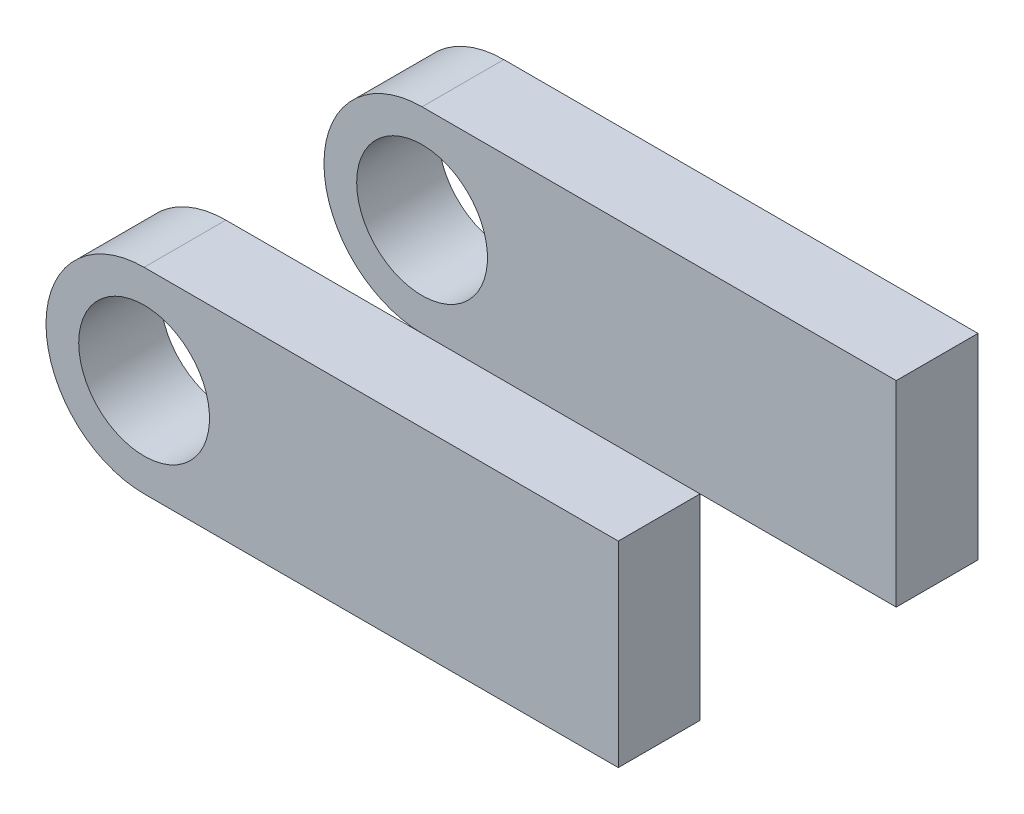
ISO-10303-21;
HEADER;
FILE_DESCRIPTION(('STEP AP214'),'2;1');
FILE_NAME('part.step','',(''),(''),'','','');
FILE_SCHEMA(('AUTOMOTIVE_DESIGN { 1 0 10303 214 1 1 1 1 }'));
ENDSEC;
DATA;
#1=APPLICATION_CONTEXT('core data for automotive mechanical design processes');
#2=APPLICATION_PROTOCOL_DEFINITION('international standard','automotive_design',2000,#1);
#3=PRODUCT_CONTEXT('',#1,'mechanical');
#4=PRODUCT('Part','Part','',(#3));
#5=PRODUCT_RELATED_PRODUCT_CATEGORY('part','',(#4));
#6=PRODUCT_DEFINITION_FORMATION('','',#4);
#7=PRODUCT_DEFINITION_CONTEXT('part definition',#1,'design');
#8=PRODUCT_DEFINITION('design','',#6,#7);
#9=PRODUCT_DEFINITION_SHAPE('','',#8);
#10=(LENGTH_UNIT() NAMED_UNIT(*) SI_UNIT(.MILLI.,.METRE.));
#11=(NAMED_UNIT(*) PLANE_ANGLE_UNIT() SI_UNIT($,.RADIAN.));
#12=(NAMED_UNIT(*) SI_UNIT($,.STERADIAN.) SOLID_ANGLE_UNIT());
#13=UNCERTAINTY_MEASURE_WITH_UNIT(LENGTH_MEASURE(1.E-05),#10,'distance_accuracy_value','');
#14=(GEOMETRIC_REPRESENTATION_CONTEXT(3) GLOBAL_UNCERTAINTY_ASSIGNED_CONTEXT((#13)) GLOBAL_UNIT_ASSIGNED_CONTEXT((#10,
#11,#12)) REPRESENTATION_CONTEXT('',''));
#15=CARTESIAN_POINT('',(0.,0.,0.));
#16=DIRECTION('',(0.,0.,1.));
#17=DIRECTION('',(1.,0.,0.));
#18=AXIS2_PLACEMENT_3D('',#15,#16,#17);
#19=CARTESIAN_POINT('',(0.,12.,0.));
#20=DIRECTION('',(0.,1.,0.));
#21=DIRECTION('',(0.,0.,1.));
#22=AXIS2_PLACEMENT_3D('',#19,#20,#21);
#23=PLANE('',#22);
#24=DIRECTION('',(-1.,0.,0.));
#25=VECTOR('',#24,1.);
#26=CARTESIAN_POINT('',(35.,12.,6.));
#27=LINE('',#26,#25);
#28=CARTESIAN_POINT('',(35.,12.,6.));
#29=VERTEX_POINT('',#28);
#30=CARTESIAN_POINT('',(6.,12.,6.));
#31=VERTEX_POINT('',#30);
#32=EDGE_CURVE('E102',#29,#31,#27,.T.);
#33=ORIENTED_EDGE('',*,*,#32,.T.);
#34=DIRECTION('',(0.,0.,-1.));
#35=VECTOR('',#34,1.);
#36=CARTESIAN_POINT('',(6.,12.,11.));
#37=LINE('',#36,#35);
#38=CARTESIAN_POINT('',(6.,12.,11.));
#39=VERTEX_POINT('',#38);
#40=EDGE_CURVE('E121',#39,#31,#37,.T.);
#41=ORIENTED_EDGE('',*,*,#40,.F.);
#42=DIRECTION('',(1.,0.,0.));
#43=VECTOR('',#42,1.);
#44=CARTESIAN_POINT('',(0.,12.,11.));
#45=LINE('',#44,#43);
#46=CARTESIAN_POINT('',(35.,12.,11.));
#47=VERTEX_POINT('',#46);
#48=EDGE_CURVE('E108',#39,#47,#45,.T.);
#49=ORIENTED_EDGE('',*,*,#48,.T.);
#50=DIRECTION('',(0.,0.,-1.));
#51=VECTOR('',#50,1.);
#52=CARTESIAN_POINT('',(35.,12.,11.));
#53=LINE('',#52,#51);
#54=EDGE_CURVE('E75',#47,#29,#53,.T.);
#55=ORIENTED_EDGE('',*,*,#54,.T.);
#56=EDGE_LOOP('',(#33,#41,#49,#55));
#57=FACE_BOUND('',#56,.T.);
#58=ADVANCED_FACE('F49',(#57),#23,.T.);
#59=CARTESIAN_POINT('',(0.,0.,0.));
#60=DIRECTION('',(0.,1.,0.));
#61=DIRECTION('',(0.,0.,1.));
#62=AXIS2_PLACEMENT_3D('',#59,#60,#61);
#63=PLANE('',#62);
#64=DIRECTION('',(0.,0.,-1.));
#65=VECTOR('',#64,1.);
#66=CARTESIAN_POINT('',(6.,0.,11.));
#67=LINE('',#66,#65);
#68=CARTESIAN_POINT('',(6.,0.,11.));
#69=VERTEX_POINT('',#68);
#70=CARTESIAN_POINT('',(6.,0.,6.));
#71=VERTEX_POINT('',#70);
#72=EDGE_CURVE('E106',#69,#71,#67,.T.);
#73=ORIENTED_EDGE('',*,*,#72,.T.);
#74=DIRECTION('',(-1.,0.,0.));
#75=VECTOR('',#74,1.);
#76=CARTESIAN_POINT('',(35.,0.,6.));
#77=LINE('',#76,#75);
#78=CARTESIAN_POINT('',(35.,0.,6.));
#79=VERTEX_POINT('',#78);
#80=EDGE_CURVE('E96',#79,#71,#77,.T.);
#81=ORIENTED_EDGE('',*,*,#80,.F.);
#82=DIRECTION('',(0.,0.,-1.));
#83=VECTOR('',#82,1.);
#84=CARTESIAN_POINT('',(35.,0.,11.));
#85=LINE('',#84,#83);
#86=CARTESIAN_POINT('',(35.,0.,11.));
#87=VERTEX_POINT('',#86);
#88=EDGE_CURVE('E87',#87,#79,#85,.T.);
#89=ORIENTED_EDGE('',*,*,#88,.F.);
#90=DIRECTION('',(1.,0.,0.));
#91=VECTOR('',#90,1.);
#92=CARTESIAN_POINT('',(0.,0.,11.));
#93=LINE('',#92,#91);
#94=EDGE_CURVE('E97',#69,#87,#93,.T.);
#95=ORIENTED_EDGE('',*,*,#94,.F.);
#96=EDGE_LOOP('',(#73,#81,#89,#95));
#97=FACE_BOUND('',#96,.T.);
#98=ADVANCED_FACE('F105',(#97),#63,.F.);
#99=CARTESIAN_POINT('',(0.,12.,11.));
#100=DIRECTION('',(0.,0.,-1.));
#101=DIRECTION('',(-1.,0.,0.));
#102=AXIS2_PLACEMENT_3D('',#99,#100,#101);
#103=PLANE('',#102);
#104=CARTESIAN_POINT('',(6.,6.,11.));
#105=DIRECTION('',(0.,0.,-1.));
#106=DIRECTION('',(-1.,0.,0.));
#107=AXIS2_PLACEMENT_3D('',#104,#105,#106);
#108=CIRCLE('',#107,4.);
#109=CARTESIAN_POINT('',(2.,6.,11.));
#110=VERTEX_POINT('',#109);
#111=EDGE_CURVE('E130',#110,#110,#108,.T.);
#112=ORIENTED_EDGE('',*,*,#111,.T.);
#113=EDGE_LOOP('',(#112));
#114=FACE_BOUND('',#113,.T.);
#115=ORIENTED_EDGE('',*,*,#48,.F.);
#116=CARTESIAN_POINT('',(6.,6.,11.));
#117=DIRECTION('',(0.,0.,1.));
#118=DIRECTION('',(1.,0.,0.));
#119=AXIS2_PLACEMENT_3D('',#116,#117,#118);
#120=CIRCLE('',#119,6.);
#121=EDGE_CURVE('E124',#39,#69,#120,.T.);
#122=ORIENTED_EDGE('',*,*,#121,.T.);
#123=ORIENTED_EDGE('',*,*,#94,.T.);
#124=DIRECTION('',(0.,-1.,0.));
#125=VECTOR('',#124,1.);
#126=CARTESIAN_POINT('',(35.,12.,11.));
#127=LINE('',#126,#125);
#128=EDGE_CURVE('E12',#47,#87,#127,.T.);
#129=ORIENTED_EDGE('',*,*,#128,.F.);
#130=EDGE_LOOP('',(#115,#122,#123,#129));
#131=FACE_BOUND('',#130,.T.);
#132=ADVANCED_FACE('F51',(#114,#131),#103,.F.);
#133=CARTESIAN_POINT('',(35.,12.,11.));
#134=DIRECTION('',(-1.,0.,0.));
#135=DIRECTION('',(0.,0.,1.));
#136=AXIS2_PLACEMENT_3D('',#133,#134,#135);
#137=PLANE('',#136);
#138=ORIENTED_EDGE('',*,*,#88,.T.);
#139=DIRECTION('',(0.,-1.,0.));
#140=VECTOR('',#139,1.);
#141=CARTESIAN_POINT('',(35.,12.,6.));
#142=LINE('',#141,#140);
#143=EDGE_CURVE('E59',#29,#79,#142,.T.);
#144=ORIENTED_EDGE('',*,*,#143,.F.);
#145=ORIENTED_EDGE('',*,*,#54,.F.);
#146=ORIENTED_EDGE('',*,*,#128,.T.);
#147=EDGE_LOOP('',(#138,#144,#145,#146));
#148=FACE_BOUND('',#147,.T.);
#149=ADVANCED_FACE('F89',(#148),#137,.F.);
#150=CARTESIAN_POINT('',(35.,12.,6.));
#151=DIRECTION('',(0.,0.,1.));
#152=DIRECTION('',(1.,0.,0.));
#153=AXIS2_PLACEMENT_3D('',#150,#151,#152);
#154=PLANE('',#153);
#155=CARTESIAN_POINT('',(6.,6.,6.));
#156=DIRECTION('',(0.,0.,1.));
#157=DIRECTION('',(1.,0.,0.));
#158=AXIS2_PLACEMENT_3D('',#155,#156,#157);
#159=CIRCLE('',#158,4.);
#160=CARTESIAN_POINT('',(10.,6.,6.));
#161=VERTEX_POINT('',#160);
#162=EDGE_CURVE('E53',#161,#161,#159,.T.);
#163=ORIENTED_EDGE('',*,*,#162,.T.);
#164=EDGE_LOOP('',(#163));
#165=FACE_BOUND('',#164,.T.);
#166=ORIENTED_EDGE('',*,*,#80,.T.);
#167=CARTESIAN_POINT('',(6.,6.,6.));
#168=DIRECTION('',(0.,0.,1.));
#169=DIRECTION('',(1.,0.,0.));
#170=AXIS2_PLACEMENT_3D('',#167,#168,#169);
#171=CIRCLE('',#170,6.);
#172=EDGE_CURVE('E66',#71,#31,#171,.F.);
#173=ORIENTED_EDGE('',*,*,#172,.T.);
#174=ORIENTED_EDGE('',*,*,#32,.F.);
#175=ORIENTED_EDGE('',*,*,#143,.T.);
#176=EDGE_LOOP('',(#166,#173,#174,#175));
#177=FACE_BOUND('',#176,.T.);
#178=ADVANCED_FACE('F101',(#165,#177),#154,.F.);
#179=CARTESIAN_POINT('',(6.,6.,11.));
#180=DIRECTION('',(0.,0.,-1.));
#181=DIRECTION('',(-1.,0.,0.));
#182=AXIS2_PLACEMENT_3D('',#179,#180,#181);
#183=CYLINDRICAL_SURFACE('',#182,6.);
#184=ORIENTED_EDGE('',*,*,#172,.F.);
#185=ORIENTED_EDGE('',*,*,#72,.F.);
#186=ORIENTED_EDGE('',*,*,#121,.F.);
#187=ORIENTED_EDGE('',*,*,#40,.T.);
#188=EDGE_LOOP('',(#184,#185,#186,#187));
#189=FACE_BOUND('',#188,.T.);
#190=ADVANCED_FACE('F142',(#189),#183,.T.);
#191=CARTESIAN_POINT('',(6.,6.,11.));
#192=DIRECTION('',(0.,0.,-1.));
#193=DIRECTION('',(-1.,0.,0.));
#194=AXIS2_PLACEMENT_3D('',#191,#192,#193);
#195=CYLINDRICAL_SURFACE('',#194,4.);
#196=ORIENTED_EDGE('',*,*,#111,.F.);
#197=EDGE_LOOP('',(#196));
#198=FACE_BOUND('',#197,.T.);
#199=ORIENTED_EDGE('',*,*,#162,.F.);
#200=EDGE_LOOP('',(#199));
#201=FACE_BOUND('',#200,.T.);
#202=ADVANCED_FACE('F140',(#198,#201),#195,.F.);
#203=CLOSED_SHELL('',(#58,#98,#132,#149,#178,#190,#202));
#204=MANIFOLD_SOLID_BREP('B2',#203);
#205=CARTESIAN_POINT('',(0.,12.,0.));
#206=DIRECTION('',(0.,1.,0.));
#207=DIRECTION('',(0.,0.,1.));
#208=AXIS2_PLACEMENT_3D('',#205,#206,#207);
#209=PLANE('',#208);
#210=DIRECTION('',(-1.,0.,0.));
#211=VECTOR('',#210,1.);
#212=CARTESIAN_POINT('',(35.,12.,-11.));
#213=LINE('',#212,#211);
#214=CARTESIAN_POINT('',(35.,12.,-11.));
#215=VERTEX_POINT('',#214);
#216=CARTESIAN_POINT('',(6.,12.,-11.));
#217=VERTEX_POINT('',#216);
#218=EDGE_CURVE('E259',#215,#217,#213,.T.);
#219=ORIENTED_EDGE('',*,*,#218,.T.);
#220=DIRECTION('',(0.,0.,-1.));
#221=VECTOR('',#220,1.);
#222=CARTESIAN_POINT('',(6.,12.,11.));
#223=LINE('',#222,#221);
#224=CARTESIAN_POINT('',(6.,12.,-6.));
#225=VERTEX_POINT('',#224);
#226=EDGE_CURVE('E272',#225,#217,#223,.T.);
#227=ORIENTED_EDGE('',*,*,#226,.F.);
#228=DIRECTION('',(1.,0.,0.));
#229=VECTOR('',#228,1.);
#230=CARTESIAN_POINT('',(0.,12.,-6.));
#231=LINE('',#230,#229);
#232=CARTESIAN_POINT('',(35.,12.,-6.));
#233=VERTEX_POINT('',#232);
#234=EDGE_CURVE('E262',#225,#233,#231,.T.);
#235=ORIENTED_EDGE('',*,*,#234,.T.);
#236=DIRECTION('',(0.,0.,-1.));
#237=VECTOR('',#236,1.);
#238=CARTESIAN_POINT('',(35.,12.,-6.));
#239=LINE('',#238,#237);
#240=EDGE_CURVE('E231',#233,#215,#239,.T.);
#241=ORIENTED_EDGE('',*,*,#240,.T.);
#242=EDGE_LOOP('',(#219,#227,#235,#241));
#243=FACE_BOUND('',#242,.T.);
#244=ADVANCED_FACE('F208',(#243),#209,.T.);
#245=CARTESIAN_POINT('',(0.,0.,0.));
#246=DIRECTION('',(0.,1.,0.));
#247=DIRECTION('',(0.,0.,1.));
#248=AXIS2_PLACEMENT_3D('',#245,#246,#247);
#249=PLANE('',#248);
#250=DIRECTION('',(0.,0.,-1.));
#251=VECTOR('',#250,1.);
#252=CARTESIAN_POINT('',(6.,0.,11.));
#253=LINE('',#252,#251);
#254=CARTESIAN_POINT('',(6.,0.,-11.));
#255=VERTEX_POINT('',#254);
#256=CARTESIAN_POINT('',(6.,0.,-6.));
#257=VERTEX_POINT('',#256);
#258=EDGE_CURVE('E47',#255,#257,#253,.F.);
#259=ORIENTED_EDGE('',*,*,#258,.F.);
#260=DIRECTION('',(-1.,0.,0.));
#261=VECTOR('',#260,1.);
#262=CARTESIAN_POINT('',(35.,0.,-11.));
#263=LINE('',#262,#261);
#264=CARTESIAN_POINT('',(35.,0.,-11.));
#265=VERTEX_POINT('',#264);
#266=EDGE_CURVE('E253',#265,#255,#263,.T.);
#267=ORIENTED_EDGE('',*,*,#266,.F.);
#268=DIRECTION('',(0.,0.,-1.));
#269=VECTOR('',#268,1.);
#270=CARTESIAN_POINT('',(35.,0.,-6.));
#271=LINE('',#270,#269);
#272=CARTESIAN_POINT('',(35.,0.,-6.));
#273=VERTEX_POINT('',#272);
#274=EDGE_CURVE('E244',#273,#265,#271,.T.);
#275=ORIENTED_EDGE('',*,*,#274,.F.);
#276=DIRECTION('',(1.,0.,0.));
#277=VECTOR('',#276,1.);
#278=CARTESIAN_POINT('',(0.,0.,-6.));
#279=LINE('',#278,#277);
#280=EDGE_CURVE('E254',#257,#273,#279,.T.);
#281=ORIENTED_EDGE('',*,*,#280,.F.);
#282=EDGE_LOOP('',(#259,#267,#275,#281));
#283=FACE_BOUND('',#282,.T.);
#284=ADVANCED_FACE('F261',(#283),#249,.F.);
#285=CARTESIAN_POINT('',(0.,12.,-6.));
#286=DIRECTION('',(0.,0.,-1.));
#287=DIRECTION('',(-1.,0.,0.));
#288=AXIS2_PLACEMENT_3D('',#285,#286,#287);
#289=PLANE('',#288);
#290=CARTESIAN_POINT('',(6.,6.,-6.));
#291=DIRECTION('',(0.,0.,-1.));
#292=DIRECTION('',(-1.,0.,0.));
#293=AXIS2_PLACEMENT_3D('',#290,#291,#292);
#294=CIRCLE('',#293,4.);
#295=CARTESIAN_POINT('',(2.,6.,-6.));
#296=VERTEX_POINT('',#295);
#297=EDGE_CURVE('E275',#296,#296,#294,.T.);
#298=ORIENTED_EDGE('',*,*,#297,.T.);
#299=EDGE_LOOP('',(#298));
#300=FACE_BOUND('',#299,.T.);
#301=ORIENTED_EDGE('',*,*,#234,.F.);
#302=CARTESIAN_POINT('',(6.,6.,-6.));
#303=DIRECTION('',(0.,0.,-1.));
#304=DIRECTION('',(-1.,0.,0.));
#305=AXIS2_PLACEMENT_3D('',#302,#303,#304);
#306=CIRCLE('',#305,6.);
#307=EDGE_CURVE('E267',#225,#257,#306,.F.);
#308=ORIENTED_EDGE('',*,*,#307,.T.);
#309=ORIENTED_EDGE('',*,*,#280,.T.);
#310=DIRECTION('',(0.,-1.,0.));
#311=VECTOR('',#310,1.);
#312=CARTESIAN_POINT('',(35.,12.,-6.));
#313=LINE('',#312,#311);
#314=EDGE_CURVE('E216',#233,#273,#313,.T.);
#315=ORIENTED_EDGE('',*,*,#314,.F.);
#316=EDGE_LOOP('',(#301,#308,#309,#315));
#317=FACE_BOUND('',#316,.T.);
#318=ADVANCED_FACE('F210',(#300,#317),#289,.F.);
#319=CARTESIAN_POINT('',(35.,12.,-6.));
#320=DIRECTION('',(-1.,0.,0.));
#321=DIRECTION('',(0.,0.,1.));
#322=AXIS2_PLACEMENT_3D('',#319,#320,#321);
#323=PLANE('',#322);
#324=ORIENTED_EDGE('',*,*,#274,.T.);
#325=DIRECTION('',(0.,-1.,0.));
#326=VECTOR('',#325,1.);
#327=CARTESIAN_POINT('',(35.,12.,-11.));
#328=LINE('',#327,#326);
#329=EDGE_CURVE('E247',#215,#265,#328,.T.);
#330=ORIENTED_EDGE('',*,*,#329,.F.);
#331=ORIENTED_EDGE('',*,*,#240,.F.);
#332=ORIENTED_EDGE('',*,*,#314,.T.);
#333=EDGE_LOOP('',(#324,#330,#331,#332));
#334=FACE_BOUND('',#333,.T.);
#335=ADVANCED_FACE('F246',(#334),#323,.F.);
#336=CARTESIAN_POINT('',(35.,12.,-11.));
#337=DIRECTION('',(0.,0.,1.));
#338=DIRECTION('',(1.,0.,0.));
#339=AXIS2_PLACEMENT_3D('',#336,#337,#338);
#340=PLANE('',#339);
#341=CARTESIAN_POINT('',(6.,6.,-11.));
#342=DIRECTION('',(0.,0.,-1.));
#343=DIRECTION('',(-1.,0.,0.));
#344=AXIS2_PLACEMENT_3D('',#341,#342,#343);
#345=CIRCLE('',#344,4.);
#346=CARTESIAN_POINT('',(2.,6.,-11.));
#347=VERTEX_POINT('',#346);
#348=EDGE_CURVE('E278',#347,#347,#345,.T.);
#349=ORIENTED_EDGE('',*,*,#348,.F.);
#350=EDGE_LOOP('',(#349));
#351=FACE_BOUND('',#350,.T.);
#352=ORIENTED_EDGE('',*,*,#266,.T.);
#353=CARTESIAN_POINT('',(6.,6.,-11.));
#354=DIRECTION('',(0.,0.,1.));
#355=DIRECTION('',(1.,0.,0.));
#356=AXIS2_PLACEMENT_3D('',#353,#354,#355);
#357=CIRCLE('',#356,6.);
#358=EDGE_CURVE('E222',#217,#255,#357,.T.);
#359=ORIENTED_EDGE('',*,*,#358,.F.);
#360=ORIENTED_EDGE('',*,*,#218,.F.);
#361=ORIENTED_EDGE('',*,*,#329,.T.);
#362=EDGE_LOOP('',(#352,#359,#360,#361));
#363=FACE_BOUND('',#362,.T.);
#364=ADVANCED_FACE('F258',(#351,#363),#340,.F.);
#365=CARTESIAN_POINT('',(6.,6.,11.));
#366=DIRECTION('',(0.,0.,-1.));
#367=DIRECTION('',(-1.,0.,0.));
#368=AXIS2_PLACEMENT_3D('',#365,#366,#367);
#369=CYLINDRICAL_SURFACE('',#368,6.);
#370=ORIENTED_EDGE('',*,*,#358,.T.);
#371=ORIENTED_EDGE('',*,*,#258,.T.);
#372=ORIENTED_EDGE('',*,*,#307,.F.);
#373=ORIENTED_EDGE('',*,*,#226,.T.);
#374=EDGE_LOOP('',(#370,#371,#372,#373));
#375=FACE_BOUND('',#374,.T.);
#376=ADVANCED_FACE('F286',(#375),#369,.T.);
#377=CARTESIAN_POINT('',(6.,6.,11.));
#378=DIRECTION('',(0.,0.,-1.));
#379=DIRECTION('',(-1.,0.,0.));
#380=AXIS2_PLACEMENT_3D('',#377,#378,#379);
#381=CYLINDRICAL_SURFACE('',#380,4.);
#382=ORIENTED_EDGE('',*,*,#348,.T.);
#383=EDGE_LOOP('',(#382));
#384=FACE_BOUND('',#383,.T.);
#385=ORIENTED_EDGE('',*,*,#297,.F.);
#386=EDGE_LOOP('',(#385));
#387=FACE_BOUND('',#386,.T.);
#388=ADVANCED_FACE('F282',(#384,#387),#381,.F.);
#389=CLOSED_SHELL('',(#244,#284,#318,#335,#364,#376,#388));
#390=MANIFOLD_SOLID_BREP('B6',#389);
#391=ADVANCED_BREP_SHAPE_REPRESENTATION('',(#18,#204,#390),#14);
#392=SHAPE_DEFINITION_REPRESENTATION(#9,#391);
ENDSEC;
END-ISO-10303-21;
